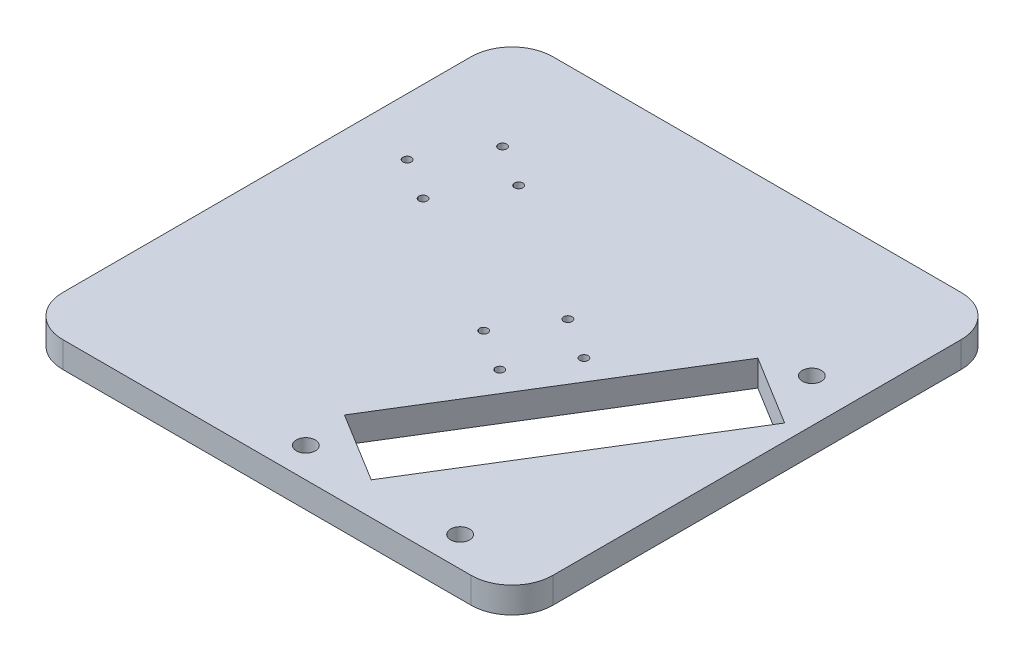
ISO-10303-21;
HEADER;
FILE_DESCRIPTION(('STEP AP214'),'2;1');
FILE_NAME('part.step','',(''),(''),'','','');
FILE_SCHEMA(('AUTOMOTIVE_DESIGN { 1 0 10303 214 1 1 1 1 }'));
ENDSEC;
DATA;
#1=APPLICATION_CONTEXT('core data for automotive mechanical design processes');
#2=APPLICATION_PROTOCOL_DEFINITION('international standard','automotive_design',2000,#1);
#3=PRODUCT_CONTEXT('',#1,'mechanical');
#4=PRODUCT('Part','Part','',(#3));
#5=PRODUCT_RELATED_PRODUCT_CATEGORY('part','',(#4));
#6=PRODUCT_DEFINITION_FORMATION('','',#4);
#7=PRODUCT_DEFINITION_CONTEXT('part definition',#1,'design');
#8=PRODUCT_DEFINITION('design','',#6,#7);
#9=PRODUCT_DEFINITION_SHAPE('','',#8);
#10=(LENGTH_UNIT() NAMED_UNIT(*) SI_UNIT(.MILLI.,.METRE.));
#11=(NAMED_UNIT(*) PLANE_ANGLE_UNIT() SI_UNIT($,.RADIAN.));
#12=(NAMED_UNIT(*) SI_UNIT($,.STERADIAN.) SOLID_ANGLE_UNIT());
#13=UNCERTAINTY_MEASURE_WITH_UNIT(LENGTH_MEASURE(1.E-05),#10,'distance_accuracy_value','');
#14=(GEOMETRIC_REPRESENTATION_CONTEXT(3) GLOBAL_UNCERTAINTY_ASSIGNED_CONTEXT((#13)) GLOBAL_UNIT_ASSIGNED_CONTEXT((#10,
#11,#12)) REPRESENTATION_CONTEXT('',''));
#15=CARTESIAN_POINT('',(0.,0.,0.));
#16=DIRECTION('',(0.,0.,1.));
#17=DIRECTION('',(1.,0.,0.));
#18=AXIS2_PLACEMENT_3D('',#15,#16,#17);
#19=CARTESIAN_POINT('',(110.,6.35,-10.));
#20=DIRECTION('',(0.,-1.,0.));
#21=DIRECTION('',(0.,0.,-1.));
#22=AXIS2_PLACEMENT_3D('',#19,#20,#21);
#23=CYLINDRICAL_SURFACE('',#22,10.);
#24=CARTESIAN_POINT('',(110.,0.,-10.));
#25=DIRECTION('',(0.,1.,0.));
#26=DIRECTION('',(0.,0.,1.));
#27=AXIS2_PLACEMENT_3D('',#24,#25,#26);
#28=CIRCLE('',#27,10.);
#29=CARTESIAN_POINT('',(110.,0.,0.));
#30=VERTEX_POINT('',#29);
#31=CARTESIAN_POINT('',(120.,0.,-10.));
#32=VERTEX_POINT('',#31);
#33=EDGE_CURVE('E297',#30,#32,#28,.T.);
#34=ORIENTED_EDGE('',*,*,#33,.T.);
#35=DIRECTION('',(0.,-1.,0.));
#36=VECTOR('',#35,1.);
#37=CARTESIAN_POINT('',(120.,6.35,-10.));
#38=LINE('',#37,#36);
#39=CARTESIAN_POINT('',(120.,6.35,-10.));
#40=VERTEX_POINT('',#39);
#41=EDGE_CURVE('E12',#40,#32,#38,.T.);
#42=ORIENTED_EDGE('',*,*,#41,.F.);
#43=CARTESIAN_POINT('',(110.,6.35,-10.));
#44=DIRECTION('',(0.,1.,0.));
#45=DIRECTION('',(0.,0.,1.));
#46=AXIS2_PLACEMENT_3D('',#43,#44,#45);
#47=CIRCLE('',#46,10.);
#48=CARTESIAN_POINT('',(110.,6.35,0.));
#49=VERTEX_POINT('',#48);
#50=EDGE_CURVE('E284',#49,#40,#47,.T.);
#51=ORIENTED_EDGE('',*,*,#50,.F.);
#52=DIRECTION('',(0.,-1.,0.));
#53=VECTOR('',#52,1.);
#54=CARTESIAN_POINT('',(110.,6.35,0.));
#55=LINE('',#54,#53);
#56=EDGE_CURVE('E331',#49,#30,#55,.T.);
#57=ORIENTED_EDGE('',*,*,#56,.T.);
#58=EDGE_LOOP('',(#34,#42,#51,#57));
#59=FACE_BOUND('',#58,.T.);
#60=ADVANCED_FACE('F37',(#59),#23,.T.);
#61=CARTESIAN_POINT('',(120.,6.35,-10.));
#62=DIRECTION('',(-1.,0.,0.));
#63=DIRECTION('',(0.,0.,1.));
#64=AXIS2_PLACEMENT_3D('',#61,#62,#63);
#65=PLANE('',#64);
#66=DIRECTION('',(0.,0.,-1.));
#67=VECTOR('',#66,1.);
#68=CARTESIAN_POINT('',(120.,0.,-10.));
#69=LINE('',#68,#67);
#70=CARTESIAN_POINT('',(120.,0.,-110.));
#71=VERTEX_POINT('',#70);
#72=EDGE_CURVE('E300',#32,#71,#69,.T.);
#73=ORIENTED_EDGE('',*,*,#72,.T.);
#74=DIRECTION('',(0.,-1.,0.));
#75=VECTOR('',#74,1.);
#76=CARTESIAN_POINT('',(120.,6.35,-110.));
#77=LINE('',#76,#75);
#78=CARTESIAN_POINT('',(120.,6.35,-110.));
#79=VERTEX_POINT('',#78);
#80=EDGE_CURVE('E44',#79,#71,#77,.T.);
#81=ORIENTED_EDGE('',*,*,#80,.F.);
#82=DIRECTION('',(0.,0.,-1.));
#83=VECTOR('',#82,1.);
#84=CARTESIAN_POINT('',(120.,6.35,-10.));
#85=LINE('',#84,#83);
#86=EDGE_CURVE('E286',#40,#79,#85,.T.);
#87=ORIENTED_EDGE('',*,*,#86,.F.);
#88=ORIENTED_EDGE('',*,*,#41,.T.);
#89=EDGE_LOOP('',(#73,#81,#87,#88));
#90=FACE_BOUND('',#89,.T.);
#91=ADVANCED_FACE('F299',(#90),#65,.F.);
#92=CARTESIAN_POINT('',(110.,6.35,-110.));
#93=DIRECTION('',(0.,-1.,0.));
#94=DIRECTION('',(0.,0.,-1.));
#95=AXIS2_PLACEMENT_3D('',#92,#93,#94);
#96=CYLINDRICAL_SURFACE('',#95,10.);
#97=CARTESIAN_POINT('',(110.,0.,-110.));
#98=DIRECTION('',(0.,1.,0.));
#99=DIRECTION('',(0.,0.,-1.));
#100=AXIS2_PLACEMENT_3D('',#97,#98,#99);
#101=CIRCLE('',#100,10.);
#102=CARTESIAN_POINT('',(110.,0.,-120.));
#103=VERTEX_POINT('',#102);
#104=EDGE_CURVE('E335',#71,#103,#101,.T.);
#105=ORIENTED_EDGE('',*,*,#104,.T.);
#106=DIRECTION('',(0.,-1.,0.));
#107=VECTOR('',#106,1.);
#108=CARTESIAN_POINT('',(110.,6.35,-120.));
#109=LINE('',#108,#107);
#110=CARTESIAN_POINT('',(110.,6.35,-120.));
#111=VERTEX_POINT('',#110);
#112=EDGE_CURVE('E359',#111,#103,#109,.T.);
#113=ORIENTED_EDGE('',*,*,#112,.F.);
#114=CARTESIAN_POINT('',(110.,6.35,-110.));
#115=DIRECTION('',(0.,1.,0.));
#116=DIRECTION('',(0.,0.,-1.));
#117=AXIS2_PLACEMENT_3D('',#114,#115,#116);
#118=CIRCLE('',#117,10.);
#119=EDGE_CURVE('E303',#79,#111,#118,.T.);
#120=ORIENTED_EDGE('',*,*,#119,.F.);
#121=ORIENTED_EDGE('',*,*,#80,.T.);
#122=EDGE_LOOP('',(#105,#113,#120,#121));
#123=FACE_BOUND('',#122,.T.);
#124=ADVANCED_FACE('F363',(#123),#96,.T.);
#125=CARTESIAN_POINT('',(10.,6.35,-120.));
#126=DIRECTION('',(0.,0.,1.));
#127=DIRECTION('',(1.,0.,0.));
#128=AXIS2_PLACEMENT_3D('',#125,#126,#127);
#129=PLANE('',#128);
#130=DIRECTION('',(-1.,0.,0.));
#131=VECTOR('',#130,1.);
#132=CARTESIAN_POINT('',(10.,0.,-120.));
#133=LINE('',#132,#131);
#134=CARTESIAN_POINT('',(10.,0.,-120.));
#135=VERTEX_POINT('',#134);
#136=EDGE_CURVE('E337',#103,#135,#133,.T.);
#137=ORIENTED_EDGE('',*,*,#136,.T.);
#138=DIRECTION('',(0.,-1.,0.));
#139=VECTOR('',#138,1.);
#140=CARTESIAN_POINT('',(10.,6.35,-120.));
#141=LINE('',#140,#139);
#142=CARTESIAN_POINT('',(10.,6.35,-120.));
#143=VERTEX_POINT('',#142);
#144=EDGE_CURVE('E356',#143,#135,#141,.T.);
#145=ORIENTED_EDGE('',*,*,#144,.F.);
#146=DIRECTION('',(-1.,0.,0.));
#147=VECTOR('',#146,1.);
#148=CARTESIAN_POINT('',(10.,6.35,-120.));
#149=LINE('',#148,#147);
#150=EDGE_CURVE('E305',#111,#143,#149,.T.);
#151=ORIENTED_EDGE('',*,*,#150,.F.);
#152=ORIENTED_EDGE('',*,*,#112,.T.);
#153=EDGE_LOOP('',(#137,#145,#151,#152));
#154=FACE_BOUND('',#153,.T.);
#155=ADVANCED_FACE('F371',(#154),#129,.F.);
#156=CARTESIAN_POINT('',(10.,6.35,-110.));
#157=DIRECTION('',(0.,-1.,0.));
#158=DIRECTION('',(0.,0.,-1.));
#159=AXIS2_PLACEMENT_3D('',#156,#157,#158);
#160=CYLINDRICAL_SURFACE('',#159,10.);
#161=CARTESIAN_POINT('',(10.,0.,-110.));
#162=DIRECTION('',(0.,1.,0.));
#163=DIRECTION('',(0.,0.,-1.));
#164=AXIS2_PLACEMENT_3D('',#161,#162,#163);
#165=CIRCLE('',#164,10.);
#166=CARTESIAN_POINT('',(0.,0.,-110.));
#167=VERTEX_POINT('',#166);
#168=EDGE_CURVE('E339',#135,#167,#165,.T.);
#169=ORIENTED_EDGE('',*,*,#168,.T.);
#170=DIRECTION('',(0.,-1.,0.));
#171=VECTOR('',#170,1.);
#172=CARTESIAN_POINT('',(0.,6.35,-110.));
#173=LINE('',#172,#171);
#174=CARTESIAN_POINT('',(0.,6.35,-110.));
#175=VERTEX_POINT('',#174);
#176=EDGE_CURVE('E353',#175,#167,#173,.T.);
#177=ORIENTED_EDGE('',*,*,#176,.F.);
#178=CARTESIAN_POINT('',(10.,6.35,-110.));
#179=DIRECTION('',(0.,1.,0.));
#180=DIRECTION('',(0.,0.,-1.));
#181=AXIS2_PLACEMENT_3D('',#178,#179,#180);
#182=CIRCLE('',#181,10.);
#183=EDGE_CURVE('E321',#143,#175,#182,.T.);
#184=ORIENTED_EDGE('',*,*,#183,.F.);
#185=ORIENTED_EDGE('',*,*,#144,.T.);
#186=EDGE_LOOP('',(#169,#177,#184,#185));
#187=FACE_BOUND('',#186,.T.);
#188=ADVANCED_FACE('F375',(#187),#160,.T.);
#189=CARTESIAN_POINT('',(0.,6.35,-10.0000000000001));
#190=DIRECTION('',(1.,0.,0.));
#191=DIRECTION('',(0.,0.,-1.));
#192=AXIS2_PLACEMENT_3D('',#189,#190,#191);
#193=PLANE('',#192);
#194=DIRECTION('',(0.,0.,1.));
#195=VECTOR('',#194,1.);
#196=CARTESIAN_POINT('',(0.,0.,-10.0000000000001));
#197=LINE('',#196,#195);
#198=CARTESIAN_POINT('',(0.,0.,-10.0000000000001));
#199=VERTEX_POINT('',#198);
#200=EDGE_CURVE('E341',#167,#199,#197,.T.);
#201=ORIENTED_EDGE('',*,*,#200,.T.);
#202=DIRECTION('',(0.,-1.,0.));
#203=VECTOR('',#202,1.);
#204=CARTESIAN_POINT('',(0.,6.35,-10.0000000000001));
#205=LINE('',#204,#203);
#206=CARTESIAN_POINT('',(0.,6.35,-10.0000000000001));
#207=VERTEX_POINT('',#206);
#208=EDGE_CURVE('E350',#207,#199,#205,.T.);
#209=ORIENTED_EDGE('',*,*,#208,.F.);
#210=DIRECTION('',(0.,0.,1.));
#211=VECTOR('',#210,1.);
#212=CARTESIAN_POINT('',(0.,6.35,-10.0000000000001));
#213=LINE('',#212,#211);
#214=EDGE_CURVE('E324',#175,#207,#213,.T.);
#215=ORIENTED_EDGE('',*,*,#214,.F.);
#216=ORIENTED_EDGE('',*,*,#176,.T.);
#217=EDGE_LOOP('',(#201,#209,#215,#216));
#218=FACE_BOUND('',#217,.T.);
#219=ADVANCED_FACE('F382',(#218),#193,.F.);
#220=CARTESIAN_POINT('',(10.,6.35,-10.));
#221=DIRECTION('',(0.,-1.,0.));
#222=DIRECTION('',(0.,0.,-1.));
#223=AXIS2_PLACEMENT_3D('',#220,#221,#222);
#224=CYLINDRICAL_SURFACE('',#223,10.);
#225=CARTESIAN_POINT('',(10.,0.,-10.));
#226=DIRECTION('',(0.,1.,0.));
#227=DIRECTION('',(0.,0.,-1.));
#228=AXIS2_PLACEMENT_3D('',#225,#226,#227);
#229=CIRCLE('',#228,10.);
#230=CARTESIAN_POINT('',(10.0000000000001,0.,0.));
#231=VERTEX_POINT('',#230);
#232=EDGE_CURVE('E343',#199,#231,#229,.T.);
#233=ORIENTED_EDGE('',*,*,#232,.T.);
#234=DIRECTION('',(0.,-1.,0.));
#235=VECTOR('',#234,1.);
#236=CARTESIAN_POINT('',(10.0000000000001,6.35,0.));
#237=LINE('',#236,#235);
#238=CARTESIAN_POINT('',(10.0000000000001,6.35,0.));
#239=VERTEX_POINT('',#238);
#240=EDGE_CURVE('E347',#239,#231,#237,.T.);
#241=ORIENTED_EDGE('',*,*,#240,.F.);
#242=CARTESIAN_POINT('',(10.,6.35,-10.));
#243=DIRECTION('',(0.,1.,0.));
#244=DIRECTION('',(0.,0.,-1.));
#245=AXIS2_PLACEMENT_3D('',#242,#243,#244);
#246=CIRCLE('',#245,10.);
#247=EDGE_CURVE('E327',#207,#239,#246,.T.);
#248=ORIENTED_EDGE('',*,*,#247,.F.);
#249=ORIENTED_EDGE('',*,*,#208,.T.);
#250=EDGE_LOOP('',(#233,#241,#248,#249));
#251=FACE_BOUND('',#250,.T.);
#252=ADVANCED_FACE('F385',(#251),#224,.T.);
#253=CARTESIAN_POINT('',(10.0000000000001,6.35,0.));
#254=DIRECTION('',(0.,0.,-1.));
#255=DIRECTION('',(-1.,0.,0.));
#256=AXIS2_PLACEMENT_3D('',#253,#254,#255);
#257=PLANE('',#256);
#258=DIRECTION('',(1.,0.,0.));
#259=VECTOR('',#258,1.);
#260=CARTESIAN_POINT('',(10.0000000000001,0.,0.));
#261=LINE('',#260,#259);
#262=EDGE_CURVE('E293',#231,#30,#261,.T.);
#263=ORIENTED_EDGE('',*,*,#262,.T.);
#264=ORIENTED_EDGE('',*,*,#56,.F.);
#265=DIRECTION('',(1.,0.,0.));
#266=VECTOR('',#265,1.);
#267=CARTESIAN_POINT('',(10.0000000000001,6.35,0.));
#268=LINE('',#267,#266);
#269=EDGE_CURVE('E289',#239,#49,#268,.T.);
#270=ORIENTED_EDGE('',*,*,#269,.F.);
#271=ORIENTED_EDGE('',*,*,#240,.T.);
#272=EDGE_LOOP('',(#263,#264,#270,#271));
#273=FACE_BOUND('',#272,.T.);
#274=ADVANCED_FACE('F255',(#273),#257,.F.);
#275=CARTESIAN_POINT('',(110.,6.35,-10.));
#276=DIRECTION('',(0.,1.,0.));
#277=DIRECTION('',(0.,0.,1.));
#278=AXIS2_PLACEMENT_3D('',#275,#276,#277);
#279=PLANE('',#278);
#280=CARTESIAN_POINT('',(69.8599764019738,6.35,-47.1201112861765));
#281=DIRECTION('',(0.,1.,0.));
#282=DIRECTION('',(0.,0.,1.));
#283=AXIS2_PLACEMENT_3D('',#280,#281,#282);
#284=CIRCLE('',#283,1.025);
#285=CARTESIAN_POINT('',(69.8599764019738,6.35,-46.0951112861765));
#286=VERTEX_POINT('',#285);
#287=EDGE_CURVE('E236',#286,#286,#284,.T.);
#288=ORIENTED_EDGE('',*,*,#287,.F.);
#289=EDGE_LOOP('',(#288));
#290=FACE_BOUND('',#289,.T.);
#291=CARTESIAN_POINT('',(22.8862100166563,6.35,-94.81146555063));
#292=DIRECTION('',(0.,1.,0.));
#293=DIRECTION('',(0.,0.,1.));
#294=AXIS2_PLACEMENT_3D('',#291,#292,#293);
#295=CIRCLE('',#294,1.025);
#296=CARTESIAN_POINT('',(22.8862100166563,6.35,-93.78646555063));
#297=VERTEX_POINT('',#296);
#298=EDGE_CURVE('E232',#297,#297,#295,.T.);
#299=ORIENTED_EDGE('',*,*,#298,.F.);
#300=EDGE_LOOP('',(#299));
#301=FACE_BOUND('',#300,.T.);
#302=CARTESIAN_POINT('',(33.1063121812005,6.35,-88.5226252961572));
#303=DIRECTION('',(0.,1.,0.));
#304=DIRECTION('',(0.,0.,1.));
#305=AXIS2_PLACEMENT_3D('',#302,#303,#304);
#306=CIRCLE('',#305,1.025);
#307=CARTESIAN_POINT('',(33.1063121812005,6.35,-87.4976252961572));
#308=VERTEX_POINT('',#307);
#309=EDGE_CURVE('E226',#308,#308,#306,.T.);
#310=ORIENTED_EDGE('',*,*,#309,.F.);
#311=EDGE_LOOP('',(#310));
#312=FACE_BOUND('',#311,.T.);
#313=CARTESIAN_POINT('',(24.1971218206974,6.35,-74.0441472297195));
#314=DIRECTION('',(0.,1.,0.));
#315=DIRECTION('',(0.,0.,1.));
#316=AXIS2_PLACEMENT_3D('',#313,#314,#315);
#317=CIRCLE('',#316,1.025);
#318=CARTESIAN_POINT('',(24.1971218206974,6.35,-73.0191472297195));
#319=VERTEX_POINT('',#318);
#320=EDGE_CURVE('E217',#319,#319,#317,.T.);
#321=ORIENTED_EDGE('',*,*,#320,.F.);
#322=EDGE_LOOP('',(#321));
#323=FACE_BOUND('',#322,.T.);
#324=CARTESIAN_POINT('',(13.9770196561531,6.35,-80.3329874841923));
#325=DIRECTION('',(0.,1.,0.));
#326=DIRECTION('',(0.,0.,1.));
#327=AXIS2_PLACEMENT_3D('',#324,#325,#326);
#328=CIRCLE('',#327,1.025);
#329=CARTESIAN_POINT('',(13.9770196561531,6.35,-79.3079874841923));
#330=VERTEX_POINT('',#329);
#331=EDGE_CURVE('E149',#330,#330,#328,.T.);
#332=ORIENTED_EDGE('',*,*,#331,.F.);
#333=EDGE_LOOP('',(#332));
#334=FACE_BOUND('',#333,.T.);
#335=CARTESIAN_POINT('',(67.5009245555206,6.35,-66.1840792463296));
#336=DIRECTION('',(0.,1.,0.));
#337=DIRECTION('',(0.,0.,1.));
#338=AXIS2_PLACEMENT_3D('',#335,#336,#337);
#339=CIRCLE('',#338,1.025);
#340=CARTESIAN_POINT('',(67.5009245555206,6.35,-65.1590792463296));
#341=VERTEX_POINT('',#340);
#342=EDGE_CURVE('E207',#341,#341,#339,.T.);
#343=ORIENTED_EDGE('',*,*,#342,.F.);
#344=EDGE_LOOP('',(#343));
#345=FACE_BOUND('',#344,.T.);
#346=CARTESIAN_POINT('',(77.7210267200649,6.35,-59.8952389918568));
#347=DIRECTION('',(0.,1.,0.));
#348=DIRECTION('',(0.,0.,1.));
#349=AXIS2_PLACEMENT_3D('',#346,#347,#348);
#350=CIRCLE('',#349,1.025);
#351=CARTESIAN_POINT('',(77.7210267200649,6.35,-58.8702389918568));
#352=VERTEX_POINT('',#351);
#353=EDGE_CURVE('E200',#352,#352,#350,.T.);
#354=ORIENTED_EDGE('',*,*,#353,.F.);
#355=EDGE_LOOP('',(#354));
#356=FACE_BOUND('',#355,.T.);
#357=CARTESIAN_POINT('',(59.6398742374296,6.35,-53.4089515406493));
#358=DIRECTION('',(0.,1.,0.));
#359=DIRECTION('',(0.,0.,1.));
#360=AXIS2_PLACEMENT_3D('',#357,#358,#359);
#361=CIRCLE('',#360,1.025);
#362=CARTESIAN_POINT('',(59.6398742374296,6.35,-52.3839515406493));
#363=VERTEX_POINT('',#362);
#364=EDGE_CURVE('E191',#363,#363,#361,.T.);
#365=ORIENTED_EDGE('',*,*,#364,.F.);
#366=EDGE_LOOP('',(#365));
#367=FACE_BOUND('',#366,.T.);
#368=CARTESIAN_POINT('',(62.1922352653345,6.35,-7.325));
#369=DIRECTION('',(0.,1.,0.));
#370=DIRECTION('',(0.,0.,1.));
#371=AXIS2_PLACEMENT_3D('',#368,#369,#370);
#372=CIRCLE('',#371,2.32499999999999);
#373=CARTESIAN_POINT('',(62.1922352653345,6.35,-5.00000000000001));
#374=VERTEX_POINT('',#373);
#375=EDGE_CURVE('E181',#374,#374,#372,.T.);
#376=ORIENTED_EDGE('',*,*,#375,.F.);
#377=EDGE_LOOP('',(#376));
#378=FACE_BOUND('',#377,.T.);
#379=CARTESIAN_POINT('',(109.393095316901,6.35,-84.0319272650499));
#380=DIRECTION('',(0.,1.,0.));
#381=DIRECTION('',(0.,0.,1.));
#382=AXIS2_PLACEMENT_3D('',#379,#380,#381);
#383=CIRCLE('',#382,2.32499999999999);
#384=CARTESIAN_POINT('',(109.393095316901,6.35,-81.7069272650499));
#385=VERTEX_POINT('',#384);
#386=EDGE_CURVE('E173',#385,#385,#383,.T.);
#387=ORIENTED_EDGE('',*,*,#386,.F.);
#388=EDGE_LOOP('',(#387));
#389=FACE_BOUND('',#388,.T.);
#390=DIRECTION('',(-0.52407002120607,0.,0.851675180378687));
#391=VECTOR('',#390,1.);
#392=CARTESIAN_POINT('',(60.4716917434989,6.35,-18.5060551044422));
#393=LINE('',#392,#391);
#394=CARTESIAN_POINT('',(99.0327639038415,6.35,-81.172314876706));
#395=VERTEX_POINT('',#394);
#396=CARTESIAN_POINT('',(60.4716917434989,6.35,-18.5060551044422));
#397=VERTEX_POINT('',#396);
#398=EDGE_CURVE('E51',#395,#397,#393,.T.);
#399=ORIENTED_EDGE('',*,*,#398,.F.);
#400=DIRECTION('',(-0.851675180378687,0.,-0.52407002120607));
#401=VECTOR('',#400,1.);
#402=CARTESIAN_POINT('',(116.066267511415,6.35,-70.6909144525847));
#403=LINE('',#402,#401);
#404=CARTESIAN_POINT('',(116.066267511415,6.35,-70.6909144525847));
#405=VERTEX_POINT('',#404);
#406=EDGE_CURVE('E143',#405,#395,#403,.T.);
#407=ORIENTED_EDGE('',*,*,#406,.F.);
#408=DIRECTION('',(0.52407002120607,0.,-0.851675180378687));
#409=VECTOR('',#408,1.);
#410=CARTESIAN_POINT('',(77.5051953510726,6.35,-8.02465468032082));
#411=LINE('',#410,#409);
#412=CARTESIAN_POINT('',(77.5051953510726,6.35,-8.02465468032082));
#413=VERTEX_POINT('',#412);
#414=EDGE_CURVE('E146',#413,#405,#411,.T.);
#415=ORIENTED_EDGE('',*,*,#414,.F.);
#416=DIRECTION('',(0.851675180378687,0.,0.52407002120607));
#417=VECTOR('',#416,1.);
#418=CARTESIAN_POINT('',(60.4716917434989,6.35,-18.5060551044422));
#419=LINE('',#418,#417);
#420=EDGE_CURVE('E157',#397,#413,#419,.T.);
#421=ORIENTED_EDGE('',*,*,#420,.F.);
#422=EDGE_LOOP('',(#399,#407,#415,#421));
#423=FACE_BOUND('',#422,.T.);
#424=CARTESIAN_POINT('',(99.9746689344512,6.35,-7.325));
#425=DIRECTION('',(0.,1.,0.));
#426=DIRECTION('',(0.,0.,1.));
#427=AXIS2_PLACEMENT_3D('',#424,#425,#426);
#428=CIRCLE('',#427,2.32499999999999);
#429=CARTESIAN_POINT('',(99.9746689344512,6.35,-5.00000000000001));
#430=VERTEX_POINT('',#429);
#431=EDGE_CURVE('E180',#430,#430,#428,.T.);
#432=ORIENTED_EDGE('',*,*,#431,.F.);
#433=EDGE_LOOP('',(#432));
#434=FACE_BOUND('',#433,.T.);
#435=ORIENTED_EDGE('',*,*,#50,.T.);
#436=ORIENTED_EDGE('',*,*,#86,.T.);
#437=ORIENTED_EDGE('',*,*,#119,.T.);
#438=ORIENTED_EDGE('',*,*,#150,.T.);
#439=ORIENTED_EDGE('',*,*,#183,.T.);
#440=ORIENTED_EDGE('',*,*,#214,.T.);
#441=ORIENTED_EDGE('',*,*,#247,.T.);
#442=ORIENTED_EDGE('',*,*,#269,.T.);
#443=EDGE_LOOP('',(#435,#436,#437,#438,#439,#440,#441,#442));
#444=FACE_BOUND('',#443,.T.);
#445=ADVANCED_FACE('F252',(#290,#301,#312,#323,#334,#345,#356,#367,#378,#389,#423,#434,#444),
#279,.T.);
#446=CARTESIAN_POINT('',(110.,0.,-10.));
#447=DIRECTION('',(0.,1.,0.));
#448=DIRECTION('',(0.,0.,1.));
#449=AXIS2_PLACEMENT_3D('',#446,#447,#448);
#450=PLANE('',#449);
#451=CARTESIAN_POINT('',(69.8599764019738,0.,-47.1201112861765));
#452=DIRECTION('',(0.,1.,0.));
#453=DIRECTION('',(0.,0.,1.));
#454=AXIS2_PLACEMENT_3D('',#451,#452,#453);
#455=CIRCLE('',#454,1.025);
#456=CARTESIAN_POINT('',(69.8599764019738,0.,-46.0951112861765));
#457=VERTEX_POINT('',#456);
#458=EDGE_CURVE('E158',#457,#457,#455,.T.);
#459=ORIENTED_EDGE('',*,*,#458,.T.);
#460=EDGE_LOOP('',(#459));
#461=FACE_BOUND('',#460,.T.);
#462=CARTESIAN_POINT('',(22.8862100166563,0.,-94.81146555063));
#463=DIRECTION('',(0.,1.,0.));
#464=DIRECTION('',(0.,0.,1.));
#465=AXIS2_PLACEMENT_3D('',#462,#463,#464);
#466=CIRCLE('',#465,1.025);
#467=CARTESIAN_POINT('',(22.8862100166563,0.,-93.78646555063));
#468=VERTEX_POINT('',#467);
#469=EDGE_CURVE('E230',#468,#468,#466,.T.);
#470=ORIENTED_EDGE('',*,*,#469,.T.);
#471=EDGE_LOOP('',(#470));
#472=FACE_BOUND('',#471,.T.);
#473=CARTESIAN_POINT('',(33.1063121812005,0.,-88.5226252961572));
#474=DIRECTION('',(0.,1.,0.));
#475=DIRECTION('',(0.,0.,1.));
#476=AXIS2_PLACEMENT_3D('',#473,#474,#475);
#477=CIRCLE('',#476,1.025);
#478=CARTESIAN_POINT('',(33.1063121812005,0.,-87.4976252961572));
#479=VERTEX_POINT('',#478);
#480=EDGE_CURVE('E223',#479,#479,#477,.T.);
#481=ORIENTED_EDGE('',*,*,#480,.T.);
#482=EDGE_LOOP('',(#481));
#483=FACE_BOUND('',#482,.T.);
#484=CARTESIAN_POINT('',(24.1971218206974,0.,-74.0441472297195));
#485=DIRECTION('',(0.,1.,0.));
#486=DIRECTION('',(0.,0.,1.));
#487=AXIS2_PLACEMENT_3D('',#484,#485,#486);
#488=CIRCLE('',#487,1.025);
#489=CARTESIAN_POINT('',(24.1971218206974,0.,-73.0191472297195));
#490=VERTEX_POINT('',#489);
#491=EDGE_CURVE('E222',#490,#490,#488,.T.);
#492=ORIENTED_EDGE('',*,*,#491,.T.);
#493=EDGE_LOOP('',(#492));
#494=FACE_BOUND('',#493,.T.);
#495=CARTESIAN_POINT('',(13.9770196561531,0.,-80.3329874841923));
#496=DIRECTION('',(0.,1.,0.));
#497=DIRECTION('',(0.,0.,1.));
#498=AXIS2_PLACEMENT_3D('',#495,#496,#497);
#499=CIRCLE('',#498,1.025);
#500=CARTESIAN_POINT('',(13.9770196561531,0.,-79.3079874841923));
#501=VERTEX_POINT('',#500);
#502=EDGE_CURVE('E210',#501,#501,#499,.T.);
#503=ORIENTED_EDGE('',*,*,#502,.T.);
#504=EDGE_LOOP('',(#503));
#505=FACE_BOUND('',#504,.T.);
#506=CARTESIAN_POINT('',(67.5009245555206,0.,-66.1840792463296));
#507=DIRECTION('',(0.,1.,0.));
#508=DIRECTION('',(0.,0.,1.));
#509=AXIS2_PLACEMENT_3D('',#506,#507,#508);
#510=CIRCLE('',#509,1.025);
#511=CARTESIAN_POINT('',(67.5009245555206,0.,-65.1590792463296));
#512=VERTEX_POINT('',#511);
#513=EDGE_CURVE('E204',#512,#512,#510,.T.);
#514=ORIENTED_EDGE('',*,*,#513,.T.);
#515=EDGE_LOOP('',(#514));
#516=FACE_BOUND('',#515,.T.);
#517=CARTESIAN_POINT('',(77.7210267200649,0.,-59.8952389918568));
#518=DIRECTION('',(0.,1.,0.));
#519=DIRECTION('',(0.,0.,1.));
#520=AXIS2_PLACEMENT_3D('',#517,#518,#519);
#521=CIRCLE('',#520,1.025);
#522=CARTESIAN_POINT('',(77.7210267200649,0.,-58.8702389918568));
#523=VERTEX_POINT('',#522);
#524=EDGE_CURVE('E197',#523,#523,#521,.T.);
#525=ORIENTED_EDGE('',*,*,#524,.T.);
#526=EDGE_LOOP('',(#525));
#527=FACE_BOUND('',#526,.T.);
#528=CARTESIAN_POINT('',(59.6398742374296,0.,-53.4089515406493));
#529=DIRECTION('',(0.,1.,0.));
#530=DIRECTION('',(0.,0.,1.));
#531=AXIS2_PLACEMENT_3D('',#528,#529,#530);
#532=CIRCLE('',#531,1.025);
#533=CARTESIAN_POINT('',(59.6398742374296,0.,-52.3839515406493));
#534=VERTEX_POINT('',#533);
#535=EDGE_CURVE('E196',#534,#534,#532,.T.);
#536=ORIENTED_EDGE('',*,*,#535,.T.);
#537=EDGE_LOOP('',(#536));
#538=FACE_BOUND('',#537,.T.);
#539=CARTESIAN_POINT('',(62.1922352653345,0.,-7.325));
#540=DIRECTION('',(0.,1.,0.));
#541=DIRECTION('',(0.,0.,1.));
#542=AXIS2_PLACEMENT_3D('',#539,#540,#541);
#543=CIRCLE('',#542,2.32499999999999);
#544=CARTESIAN_POINT('',(62.1922352653345,0.,-5.00000000000001));
#545=VERTEX_POINT('',#544);
#546=EDGE_CURVE('E177',#545,#545,#543,.T.);
#547=ORIENTED_EDGE('',*,*,#546,.T.);
#548=EDGE_LOOP('',(#547));
#549=FACE_BOUND('',#548,.T.);
#550=CARTESIAN_POINT('',(109.393095316901,0.,-84.0319272650499));
#551=DIRECTION('',(0.,1.,0.));
#552=DIRECTION('',(0.,0.,1.));
#553=AXIS2_PLACEMENT_3D('',#550,#551,#552);
#554=CIRCLE('',#553,2.32499999999999);
#555=CARTESIAN_POINT('',(109.393095316901,0.,-81.7069272650499));
#556=VERTEX_POINT('',#555);
#557=EDGE_CURVE('E185',#556,#556,#554,.T.);
#558=ORIENTED_EDGE('',*,*,#557,.T.);
#559=EDGE_LOOP('',(#558));
#560=FACE_BOUND('',#559,.T.);
#561=DIRECTION('',(-0.851675180378687,0.,-0.52407002120607));
#562=VECTOR('',#561,1.);
#563=CARTESIAN_POINT('',(116.066267511415,0.,-70.6909144525847));
#564=LINE('',#563,#562);
#565=CARTESIAN_POINT('',(116.066267511415,0.,-70.6909144525847));
#566=VERTEX_POINT('',#565);
#567=CARTESIAN_POINT('',(99.0327639038415,0.,-81.172314876706));
#568=VERTEX_POINT('',#567);
#569=EDGE_CURVE('E133',#566,#568,#564,.T.);
#570=ORIENTED_EDGE('',*,*,#569,.T.);
#571=DIRECTION('',(-0.52407002120607,0.,0.851675180378687));
#572=VECTOR('',#571,1.);
#573=CARTESIAN_POINT('',(60.4716917434989,0.,-18.5060551044422));
#574=LINE('',#573,#572);
#575=CARTESIAN_POINT('',(60.4716917434989,0.,-18.5060551044422));
#576=VERTEX_POINT('',#575);
#577=EDGE_CURVE('E127',#568,#576,#574,.T.);
#578=ORIENTED_EDGE('',*,*,#577,.T.);
#579=DIRECTION('',(0.851675180378687,0.,0.52407002120607));
#580=VECTOR('',#579,1.);
#581=CARTESIAN_POINT('',(60.4716917434989,0.,-18.5060551044422));
#582=LINE('',#581,#580);
#583=CARTESIAN_POINT('',(77.5051953510726,0.,-8.02465468032082));
#584=VERTEX_POINT('',#583);
#585=EDGE_CURVE('E136',#576,#584,#582,.T.);
#586=ORIENTED_EDGE('',*,*,#585,.T.);
#587=DIRECTION('',(0.52407002120607,0.,-0.851675180378687));
#588=VECTOR('',#587,1.);
#589=CARTESIAN_POINT('',(77.5051953510726,0.,-8.02465468032082));
#590=LINE('',#589,#588);
#591=EDGE_CURVE('E59',#584,#566,#590,.T.);
#592=ORIENTED_EDGE('',*,*,#591,.T.);
#593=EDGE_LOOP('',(#570,#578,#586,#592));
#594=FACE_BOUND('',#593,.T.);
#595=CARTESIAN_POINT('',(99.9746689344512,0.,-7.325));
#596=DIRECTION('',(0.,1.,0.));
#597=DIRECTION('',(0.,0.,1.));
#598=AXIS2_PLACEMENT_3D('',#595,#596,#597);
#599=CIRCLE('',#598,2.32499999999999);
#600=CARTESIAN_POINT('',(99.9746689344512,0.,-5.00000000000001));
#601=VERTEX_POINT('',#600);
#602=EDGE_CURVE('E333',#601,#601,#599,.T.);
#603=ORIENTED_EDGE('',*,*,#602,.T.);
#604=EDGE_LOOP('',(#603));
#605=FACE_BOUND('',#604,.T.);
#606=ORIENTED_EDGE('',*,*,#33,.F.);
#607=ORIENTED_EDGE('',*,*,#262,.F.);
#608=ORIENTED_EDGE('',*,*,#232,.F.);
#609=ORIENTED_EDGE('',*,*,#200,.F.);
#610=ORIENTED_EDGE('',*,*,#168,.F.);
#611=ORIENTED_EDGE('',*,*,#136,.F.);
#612=ORIENTED_EDGE('',*,*,#104,.F.);
#613=ORIENTED_EDGE('',*,*,#72,.F.);
#614=EDGE_LOOP('',(#606,#607,#608,#609,#610,#611,#612,#613));
#615=FACE_BOUND('',#614,.T.);
#616=ADVANCED_FACE('F140',(#461,#472,#483,#494,#505,#516,#527,#538,#549,#560,#594,#605,#615),
#450,.F.);
#617=CARTESIAN_POINT('',(99.9746689344512,0.,-7.325));
#618=DIRECTION('',(0.,1.,0.));
#619=DIRECTION('',(0.,0.,1.));
#620=AXIS2_PLACEMENT_3D('',#617,#618,#619);
#621=CYLINDRICAL_SURFACE('',#620,2.32499999999999);
#622=ORIENTED_EDGE('',*,*,#602,.F.);
#623=EDGE_LOOP('',(#622));
#624=FACE_BOUND('',#623,.T.);
#625=ORIENTED_EDGE('',*,*,#431,.T.);
#626=EDGE_LOOP('',(#625));
#627=FACE_BOUND('',#626,.T.);
#628=ADVANCED_FACE('F427',(#624,#627),#621,.F.);
#629=CARTESIAN_POINT('',(60.4716917434989,0.,-18.5060551044422));
#630=DIRECTION('',(-0.851675180378687,0.,-0.52407002120607));
#631=DIRECTION('',(-0.52407002120607,0.,0.851675180378687));
#632=AXIS2_PLACEMENT_3D('',#629,#630,#631);
#633=PLANE('',#632);
#634=ORIENTED_EDGE('',*,*,#398,.T.);
#635=DIRECTION('',(0.,1.,0.));
#636=VECTOR('',#635,1.);
#637=CARTESIAN_POINT('',(60.4716917434989,0.,-18.5060551044422));
#638=LINE('',#637,#636);
#639=EDGE_CURVE('E123',#576,#397,#638,.T.);
#640=ORIENTED_EDGE('',*,*,#639,.F.);
#641=ORIENTED_EDGE('',*,*,#577,.F.);
#642=DIRECTION('',(0.,1.,0.));
#643=VECTOR('',#642,1.);
#644=CARTESIAN_POINT('',(99.0327639038415,0.,-81.172314876706));
#645=LINE('',#644,#643);
#646=EDGE_CURVE('E171',#568,#395,#645,.T.);
#647=ORIENTED_EDGE('',*,*,#646,.T.);
#648=EDGE_LOOP('',(#634,#640,#641,#647));
#649=FACE_BOUND('',#648,.T.);
#650=ADVANCED_FACE('F125',(#649),#633,.F.);
#651=CARTESIAN_POINT('',(116.066267511415,0.,-70.6909144525847));
#652=DIRECTION('',(0.52407002120607,0.,-0.851675180378687));
#653=DIRECTION('',(-0.851675180378688,0.,-0.52407002120607));
#654=AXIS2_PLACEMENT_3D('',#651,#652,#653);
#655=PLANE('',#654);
#656=ORIENTED_EDGE('',*,*,#406,.T.);
#657=ORIENTED_EDGE('',*,*,#646,.F.);
#658=ORIENTED_EDGE('',*,*,#569,.F.);
#659=DIRECTION('',(0.,1.,0.));
#660=VECTOR('',#659,1.);
#661=CARTESIAN_POINT('',(116.066267511415,0.,-70.6909144525847));
#662=LINE('',#661,#660);
#663=EDGE_CURVE('E174',#566,#405,#662,.T.);
#664=ORIENTED_EDGE('',*,*,#663,.T.);
#665=EDGE_LOOP('',(#656,#657,#658,#664));
#666=FACE_BOUND('',#665,.T.);
#667=ADVANCED_FACE('F443',(#666),#655,.F.);
#668=CARTESIAN_POINT('',(77.5051953510726,0.,-8.02465468032082));
#669=DIRECTION('',(0.851675180378687,0.,0.52407002120607));
#670=DIRECTION('',(0.52407002120607,0.,-0.851675180378687));
#671=AXIS2_PLACEMENT_3D('',#668,#669,#670);
#672=PLANE('',#671);
#673=ORIENTED_EDGE('',*,*,#414,.T.);
#674=ORIENTED_EDGE('',*,*,#663,.F.);
#675=ORIENTED_EDGE('',*,*,#591,.F.);
#676=DIRECTION('',(0.,1.,0.));
#677=VECTOR('',#676,1.);
#678=CARTESIAN_POINT('',(77.5051953510726,0.,-8.02465468032082));
#679=LINE('',#678,#677);
#680=EDGE_CURVE('E132',#584,#413,#679,.T.);
#681=ORIENTED_EDGE('',*,*,#680,.T.);
#682=EDGE_LOOP('',(#673,#674,#675,#681));
#683=FACE_BOUND('',#682,.T.);
#684=ADVANCED_FACE('F452',(#683),#672,.F.);
#685=CARTESIAN_POINT('',(60.4716917434989,0.,-18.5060551044422));
#686=DIRECTION('',(-0.52407002120607,0.,0.851675180378687));
#687=DIRECTION('',(0.851675180378687,0.,0.52407002120607));
#688=AXIS2_PLACEMENT_3D('',#685,#686,#687);
#689=PLANE('',#688);
#690=ORIENTED_EDGE('',*,*,#420,.T.);
#691=ORIENTED_EDGE('',*,*,#680,.F.);
#692=ORIENTED_EDGE('',*,*,#585,.F.);
#693=ORIENTED_EDGE('',*,*,#639,.T.);
#694=EDGE_LOOP('',(#690,#691,#692,#693));
#695=FACE_BOUND('',#694,.T.);
#696=ADVANCED_FACE('F137',(#695),#689,.F.);
#697=CARTESIAN_POINT('',(109.393095316901,0.,-84.0319272650499));
#698=DIRECTION('',(0.,1.,0.));
#699=DIRECTION('',(0.,0.,1.));
#700=AXIS2_PLACEMENT_3D('',#697,#698,#699);
#701=CYLINDRICAL_SURFACE('',#700,2.32499999999999);
#702=ORIENTED_EDGE('',*,*,#557,.F.);
#703=EDGE_LOOP('',(#702));
#704=FACE_BOUND('',#703,.T.);
#705=ORIENTED_EDGE('',*,*,#386,.T.);
#706=EDGE_LOOP('',(#705));
#707=FACE_BOUND('',#706,.T.);
#708=ADVANCED_FACE('F470',(#704,#707),#701,.F.);
#709=CARTESIAN_POINT('',(62.1922352653345,0.,-7.325));
#710=DIRECTION('',(0.,1.,0.));
#711=DIRECTION('',(0.,0.,1.));
#712=AXIS2_PLACEMENT_3D('',#709,#710,#711);
#713=CYLINDRICAL_SURFACE('',#712,2.32499999999999);
#714=ORIENTED_EDGE('',*,*,#546,.F.);
#715=EDGE_LOOP('',(#714));
#716=FACE_BOUND('',#715,.T.);
#717=ORIENTED_EDGE('',*,*,#375,.T.);
#718=EDGE_LOOP('',(#717));
#719=FACE_BOUND('',#718,.T.);
#720=ADVANCED_FACE('F479',(#716,#719),#713,.F.);
#721=CARTESIAN_POINT('',(59.6398742374296,0.,-53.4089515406493));
#722=DIRECTION('',(0.,1.,0.));
#723=DIRECTION('',(0.,0.,1.));
#724=AXIS2_PLACEMENT_3D('',#721,#722,#723);
#725=CYLINDRICAL_SURFACE('',#724,1.025);
#726=ORIENTED_EDGE('',*,*,#535,.F.);
#727=EDGE_LOOP('',(#726));
#728=FACE_BOUND('',#727,.T.);
#729=ORIENTED_EDGE('',*,*,#364,.T.);
#730=EDGE_LOOP('',(#729));
#731=FACE_BOUND('',#730,.T.);
#732=ADVANCED_FACE('F489',(#728,#731),#725,.F.);
#733=CARTESIAN_POINT('',(77.7210267200649,0.,-59.8952389918568));
#734=DIRECTION('',(0.,1.,0.));
#735=DIRECTION('',(0.,0.,1.));
#736=AXIS2_PLACEMENT_3D('',#733,#734,#735);
#737=CYLINDRICAL_SURFACE('',#736,1.025);
#738=ORIENTED_EDGE('',*,*,#524,.F.);
#739=EDGE_LOOP('',(#738));
#740=FACE_BOUND('',#739,.T.);
#741=ORIENTED_EDGE('',*,*,#353,.T.);
#742=EDGE_LOOP('',(#741));
#743=FACE_BOUND('',#742,.T.);
#744=ADVANCED_FACE('F509',(#740,#743),#737,.F.);
#745=CARTESIAN_POINT('',(67.5009245555206,0.,-66.1840792463296));
#746=DIRECTION('',(0.,1.,0.));
#747=DIRECTION('',(0.,0.,1.));
#748=AXIS2_PLACEMENT_3D('',#745,#746,#747);
#749=CYLINDRICAL_SURFACE('',#748,1.025);
#750=ORIENTED_EDGE('',*,*,#513,.F.);
#751=EDGE_LOOP('',(#750));
#752=FACE_BOUND('',#751,.T.);
#753=ORIENTED_EDGE('',*,*,#342,.T.);
#754=EDGE_LOOP('',(#753));
#755=FACE_BOUND('',#754,.T.);
#756=ADVANCED_FACE('F519',(#752,#755),#749,.F.);
#757=CARTESIAN_POINT('',(13.9770196561531,0.,-80.3329874841923));
#758=DIRECTION('',(0.,1.,0.));
#759=DIRECTION('',(0.,0.,1.));
#760=AXIS2_PLACEMENT_3D('',#757,#758,#759);
#761=CYLINDRICAL_SURFACE('',#760,1.025);
#762=ORIENTED_EDGE('',*,*,#502,.F.);
#763=EDGE_LOOP('',(#762));
#764=FACE_BOUND('',#763,.T.);
#765=ORIENTED_EDGE('',*,*,#331,.T.);
#766=EDGE_LOOP('',(#765));
#767=FACE_BOUND('',#766,.T.);
#768=ADVANCED_FACE('F529',(#764,#767),#761,.F.);
#769=CARTESIAN_POINT('',(24.1971218206974,0.,-74.0441472297195));
#770=DIRECTION('',(0.,1.,0.));
#771=DIRECTION('',(0.,0.,1.));
#772=AXIS2_PLACEMENT_3D('',#769,#770,#771);
#773=CYLINDRICAL_SURFACE('',#772,1.025);
#774=ORIENTED_EDGE('',*,*,#491,.F.);
#775=EDGE_LOOP('',(#774));
#776=FACE_BOUND('',#775,.T.);
#777=ORIENTED_EDGE('',*,*,#320,.T.);
#778=EDGE_LOOP('',(#777));
#779=FACE_BOUND('',#778,.T.);
#780=ADVANCED_FACE('F539',(#776,#779),#773,.F.);
#781=CARTESIAN_POINT('',(33.1063121812005,0.,-88.5226252961572));
#782=DIRECTION('',(0.,1.,0.));
#783=DIRECTION('',(0.,0.,1.));
#784=AXIS2_PLACEMENT_3D('',#781,#782,#783);
#785=CYLINDRICAL_SURFACE('',#784,1.025);
#786=ORIENTED_EDGE('',*,*,#480,.F.);
#787=EDGE_LOOP('',(#786));
#788=FACE_BOUND('',#787,.T.);
#789=ORIENTED_EDGE('',*,*,#309,.T.);
#790=EDGE_LOOP('',(#789));
#791=FACE_BOUND('',#790,.T.);
#792=ADVANCED_FACE('F549',(#788,#791),#785,.F.);
#793=CARTESIAN_POINT('',(22.8862100166563,0.,-94.81146555063));
#794=DIRECTION('',(0.,1.,0.));
#795=DIRECTION('',(0.,0.,1.));
#796=AXIS2_PLACEMENT_3D('',#793,#794,#795);
#797=CYLINDRICAL_SURFACE('',#796,1.025);
#798=ORIENTED_EDGE('',*,*,#469,.F.);
#799=EDGE_LOOP('',(#798));
#800=FACE_BOUND('',#799,.T.);
#801=ORIENTED_EDGE('',*,*,#298,.T.);
#802=EDGE_LOOP('',(#801));
#803=FACE_BOUND('',#802,.T.);
#804=ADVANCED_FACE('F248',(#800,#803),#797,.F.);
#805=CARTESIAN_POINT('',(69.8599764019738,0.,-47.1201112861765));
#806=DIRECTION('',(0.,1.,0.));
#807=DIRECTION('',(0.,0.,1.));
#808=AXIS2_PLACEMENT_3D('',#805,#806,#807);
#809=CYLINDRICAL_SURFACE('',#808,1.025);
#810=ORIENTED_EDGE('',*,*,#458,.F.);
#811=EDGE_LOOP('',(#810));
#812=FACE_BOUND('',#811,.T.);
#813=ORIENTED_EDGE('',*,*,#287,.T.);
#814=EDGE_LOOP('',(#813));
#815=FACE_BOUND('',#814,.T.);
#816=ADVANCED_FACE('F245',(#812,#815),#809,.F.);
#817=CLOSED_SHELL('',(#60,#91,#124,#155,#188,#219,#252,#274,#445,#616,#628,#650,#667,#684,#696,
#708,#720,#732,#744,#756,#768,#780,#792,#804,#816));
#818=MANIFOLD_SOLID_BREP('B2',#817);
#819=ADVANCED_BREP_SHAPE_REPRESENTATION('',(#18,#818),#14);
#820=SHAPE_DEFINITION_REPRESENTATION(#9,#819);
ENDSEC;
END-ISO-10303-21;
